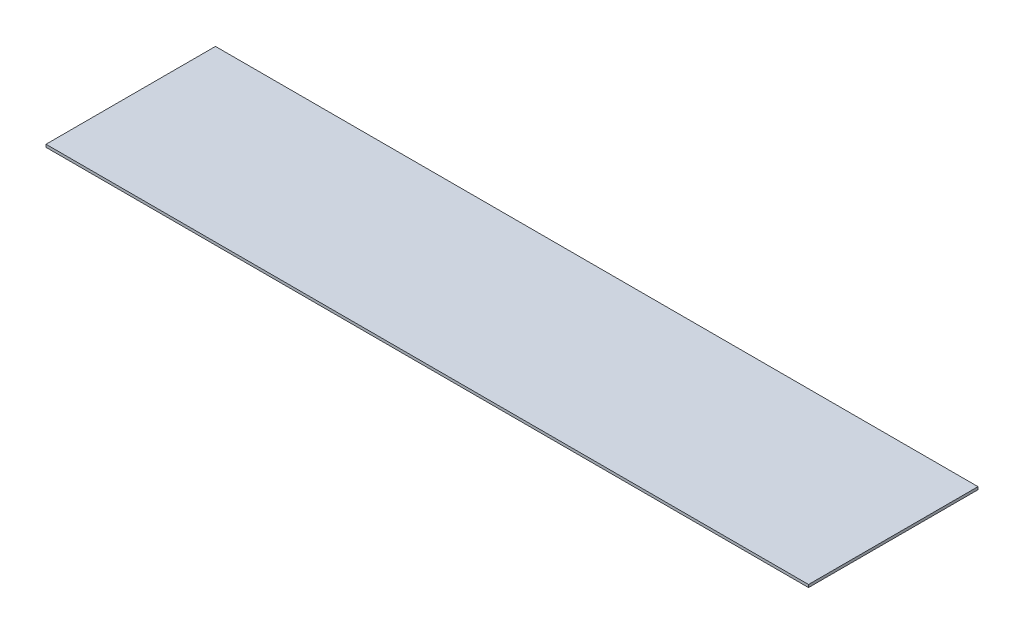
ISO-10303-21;
HEADER;
FILE_DESCRIPTION(('STEP AP214'),'2;1');
FILE_NAME('part.step','',(''),(''),'','','');
FILE_SCHEMA(('AUTOMOTIVE_DESIGN { 1 0 10303 214 1 1 1 1 }'));
ENDSEC;
DATA;
#1=APPLICATION_CONTEXT('core data for automotive mechanical design processes');
#2=APPLICATION_PROTOCOL_DEFINITION('international standard','automotive_design',2000,#1);
#3=PRODUCT_CONTEXT('',#1,'mechanical');
#4=PRODUCT('Part','Part','',(#3));
#5=PRODUCT_RELATED_PRODUCT_CATEGORY('part','',(#4));
#6=PRODUCT_DEFINITION_FORMATION('','',#4);
#7=PRODUCT_DEFINITION_CONTEXT('part definition',#1,'design');
#8=PRODUCT_DEFINITION('design','',#6,#7);
#9=PRODUCT_DEFINITION_SHAPE('','',#8);
#10=(LENGTH_UNIT() NAMED_UNIT(*) SI_UNIT(.MILLI.,.METRE.));
#11=(NAMED_UNIT(*) PLANE_ANGLE_UNIT() SI_UNIT($,.RADIAN.));
#12=(NAMED_UNIT(*) SI_UNIT($,.STERADIAN.) SOLID_ANGLE_UNIT());
#13=UNCERTAINTY_MEASURE_WITH_UNIT(LENGTH_MEASURE(1.E-05),#10,'distance_accuracy_value','');
#14=(GEOMETRIC_REPRESENTATION_CONTEXT(3) GLOBAL_UNCERTAINTY_ASSIGNED_CONTEXT((#13)) GLOBAL_UNIT_ASSIGNED_CONTEXT((#10,
#11,#12)) REPRESENTATION_CONTEXT('',''));
#15=CARTESIAN_POINT('',(0.,0.,0.));
#16=DIRECTION('',(0.,0.,1.));
#17=DIRECTION('',(1.,0.,0.));
#18=AXIS2_PLACEMENT_3D('',#15,#16,#17);
#19=CARTESIAN_POINT('',(893.7625,6.35,198.628));
#20=DIRECTION('',(-1.,0.,0.));
#21=DIRECTION('',(0.,0.,1.));
#22=AXIS2_PLACEMENT_3D('',#19,#20,#21);
#23=PLANE('',#22);
#24=DIRECTION('',(0.,0.,-1.));
#25=VECTOR('',#24,1.);
#26=CARTESIAN_POINT('',(893.7625,0.,198.628));
#27=LINE('',#26,#25);
#28=CARTESIAN_POINT('',(893.7625,0.,198.628));
#29=VERTEX_POINT('',#28);
#30=CARTESIAN_POINT('',(893.7625,0.,-198.628));
#31=VERTEX_POINT('',#30);
#32=EDGE_CURVE('E110',#29,#31,#27,.T.);
#33=ORIENTED_EDGE('',*,*,#32,.T.);
#34=DIRECTION('',(0.,-1.,0.));
#35=VECTOR('',#34,1.);
#36=CARTESIAN_POINT('',(893.7625,6.35,-198.628));
#37=LINE('',#36,#35);
#38=CARTESIAN_POINT('',(893.7625,6.35,-198.628));
#39=VERTEX_POINT('',#38);
#40=EDGE_CURVE('E11',#39,#31,#37,.T.);
#41=ORIENTED_EDGE('',*,*,#40,.F.);
#42=DIRECTION('',(0.,0.,-1.));
#43=VECTOR('',#42,1.);
#44=CARTESIAN_POINT('',(893.7625,6.35,198.628));
#45=LINE('',#44,#43);
#46=CARTESIAN_POINT('',(893.7625,6.35,198.628));
#47=VERTEX_POINT('',#46);
#48=EDGE_CURVE('E94',#47,#39,#45,.T.);
#49=ORIENTED_EDGE('',*,*,#48,.F.);
#50=DIRECTION('',(0.,-1.,0.));
#51=VECTOR('',#50,1.);
#52=CARTESIAN_POINT('',(893.7625,6.35,198.628));
#53=LINE('',#52,#51);
#54=EDGE_CURVE('E106',#47,#29,#53,.T.);
#55=ORIENTED_EDGE('',*,*,#54,.T.);
#56=EDGE_LOOP('',(#33,#41,#49,#55));
#57=FACE_BOUND('',#56,.T.);
#58=ADVANCED_FACE('F42',(#57),#23,.F.);
#59=CARTESIAN_POINT('',(-893.7625,6.35,-198.628));
#60=DIRECTION('',(0.,0.,1.));
#61=DIRECTION('',(1.,0.,0.));
#62=AXIS2_PLACEMENT_3D('',#59,#60,#61);
#63=PLANE('',#62);
#64=DIRECTION('',(-1.,0.,0.));
#65=VECTOR('',#64,1.);
#66=CARTESIAN_POINT('',(-893.7625,0.,-198.628));
#67=LINE('',#66,#65);
#68=CARTESIAN_POINT('',(-893.7625,0.,-198.628));
#69=VERTEX_POINT('',#68);
#70=EDGE_CURVE('E99',#31,#69,#67,.T.);
#71=ORIENTED_EDGE('',*,*,#70,.T.);
#72=DIRECTION('',(0.,-1.,0.));
#73=VECTOR('',#72,1.);
#74=CARTESIAN_POINT('',(-893.7625,6.35,-198.628));
#75=LINE('',#74,#73);
#76=CARTESIAN_POINT('',(-893.7625,6.35,-198.628));
#77=VERTEX_POINT('',#76);
#78=EDGE_CURVE('E51',#77,#69,#75,.T.);
#79=ORIENTED_EDGE('',*,*,#78,.F.);
#80=DIRECTION('',(-1.,0.,0.));
#81=VECTOR('',#80,1.);
#82=CARTESIAN_POINT('',(-893.7625,6.35,-198.628));
#83=LINE('',#82,#81);
#84=EDGE_CURVE('E89',#39,#77,#83,.T.);
#85=ORIENTED_EDGE('',*,*,#84,.F.);
#86=ORIENTED_EDGE('',*,*,#40,.T.);
#87=EDGE_LOOP('',(#71,#79,#85,#86));
#88=FACE_BOUND('',#87,.T.);
#89=ADVANCED_FACE('F98',(#88),#63,.F.);
#90=CARTESIAN_POINT('',(-893.7625,6.35,198.628));
#91=DIRECTION('',(1.,0.,0.));
#92=DIRECTION('',(0.,0.,-1.));
#93=AXIS2_PLACEMENT_3D('',#90,#91,#92);
#94=PLANE('',#93);
#95=DIRECTION('',(0.,0.,1.));
#96=VECTOR('',#95,1.);
#97=CARTESIAN_POINT('',(-893.7625,0.,198.628));
#98=LINE('',#97,#96);
#99=CARTESIAN_POINT('',(-893.7625,0.,198.628));
#100=VERTEX_POINT('',#99);
#101=EDGE_CURVE('E76',#69,#100,#98,.T.);
#102=ORIENTED_EDGE('',*,*,#101,.T.);
#103=DIRECTION('',(0.,-1.,0.));
#104=VECTOR('',#103,1.);
#105=CARTESIAN_POINT('',(-893.7625,6.35,198.628));
#106=LINE('',#105,#104);
#107=CARTESIAN_POINT('',(-893.7625,6.35,198.628));
#108=VERTEX_POINT('',#107);
#109=EDGE_CURVE('E101',#108,#100,#106,.T.);
#110=ORIENTED_EDGE('',*,*,#109,.F.);
#111=DIRECTION('',(0.,0.,1.));
#112=VECTOR('',#111,1.);
#113=CARTESIAN_POINT('',(-893.7625,6.35,198.628));
#114=LINE('',#113,#112);
#115=EDGE_CURVE('E92',#77,#108,#114,.T.);
#116=ORIENTED_EDGE('',*,*,#115,.F.);
#117=ORIENTED_EDGE('',*,*,#78,.T.);
#118=EDGE_LOOP('',(#102,#110,#116,#117));
#119=FACE_BOUND('',#118,.T.);
#120=ADVANCED_FACE('F102',(#119),#94,.F.);
#121=CARTESIAN_POINT('',(-893.7625,6.35,198.628));
#122=DIRECTION('',(0.,0.,-1.));
#123=DIRECTION('',(-1.,0.,0.));
#124=AXIS2_PLACEMENT_3D('',#121,#122,#123);
#125=PLANE('',#124);
#126=DIRECTION('',(1.,0.,0.));
#127=VECTOR('',#126,1.);
#128=CARTESIAN_POINT('',(-893.7625,0.,198.628));
#129=LINE('',#128,#127);
#130=EDGE_CURVE('E82',#100,#29,#129,.T.);
#131=ORIENTED_EDGE('',*,*,#130,.T.);
#132=ORIENTED_EDGE('',*,*,#54,.F.);
#133=DIRECTION('',(1.,0.,0.));
#134=VECTOR('',#133,1.);
#135=CARTESIAN_POINT('',(-893.7625,6.35,198.628));
#136=LINE('',#135,#134);
#137=EDGE_CURVE('E59',#108,#47,#136,.T.);
#138=ORIENTED_EDGE('',*,*,#137,.F.);
#139=ORIENTED_EDGE('',*,*,#109,.T.);
#140=EDGE_LOOP('',(#131,#132,#138,#139));
#141=FACE_BOUND('',#140,.T.);
#142=ADVANCED_FACE('F123',(#141),#125,.F.);
#143=CARTESIAN_POINT('',(0.,6.35,0.));
#144=DIRECTION('',(0.,-1.,0.));
#145=DIRECTION('',(0.,0.,-1.));
#146=AXIS2_PLACEMENT_3D('',#143,#144,#145);
#147=PLANE('',#146);
#148=ORIENTED_EDGE('',*,*,#48,.T.);
#149=ORIENTED_EDGE('',*,*,#84,.T.);
#150=ORIENTED_EDGE('',*,*,#115,.T.);
#151=ORIENTED_EDGE('',*,*,#137,.T.);
#152=EDGE_LOOP('',(#148,#149,#150,#151));
#153=FACE_BOUND('',#152,.T.);
#154=ADVANCED_FACE('F90',(#153),#147,.F.);
#155=CARTESIAN_POINT('',(0.,0.,0.));
#156=DIRECTION('',(0.,-1.,0.));
#157=DIRECTION('',(0.,0.,-1.));
#158=AXIS2_PLACEMENT_3D('',#155,#156,#157);
#159=PLANE('',#158);
#160=ORIENTED_EDGE('',*,*,#32,.F.);
#161=ORIENTED_EDGE('',*,*,#130,.F.);
#162=ORIENTED_EDGE('',*,*,#101,.F.);
#163=ORIENTED_EDGE('',*,*,#70,.F.);
#164=EDGE_LOOP('',(#160,#161,#162,#163));
#165=FACE_BOUND('',#164,.T.);
#166=ADVANCED_FACE('F126',(#165),#159,.T.);
#167=CLOSED_SHELL('',(#58,#89,#120,#142,#154,#166));
#168=MANIFOLD_SOLID_BREP('B2',#167);
#169=ADVANCED_BREP_SHAPE_REPRESENTATION('',(#18,#168),#14);
#170=SHAPE_DEFINITION_REPRESENTATION(#9,#169);
ENDSEC;
END-ISO-10303-21;
